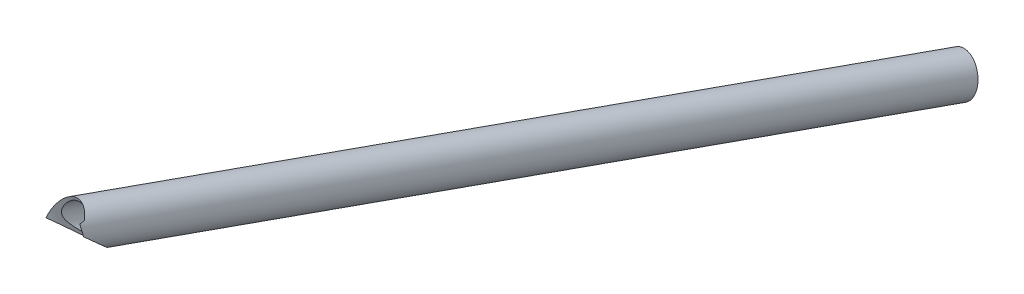
ISO-10303-21;
HEADER;
FILE_DESCRIPTION(('STEP AP214'),'2;1');
FILE_NAME('part.step','',(''),(''),'','','');
FILE_SCHEMA(('AUTOMOTIVE_DESIGN { 1 0 10303 214 1 1 1 1 }'));
ENDSEC;
DATA;
#1=APPLICATION_CONTEXT('core data for automotive mechanical design processes');
#2=APPLICATION_PROTOCOL_DEFINITION('international standard','automotive_design',2000,#1);
#3=PRODUCT_CONTEXT('',#1,'mechanical');
#4=PRODUCT('Part','Part','',(#3));
#5=PRODUCT_RELATED_PRODUCT_CATEGORY('part','',(#4));
#6=PRODUCT_DEFINITION_FORMATION('','',#4);
#7=PRODUCT_DEFINITION_CONTEXT('part definition',#1,'design');
#8=PRODUCT_DEFINITION('design','',#6,#7);
#9=PRODUCT_DEFINITION_SHAPE('','',#8);
#10=(LENGTH_UNIT() NAMED_UNIT(*) SI_UNIT(.MILLI.,.METRE.));
#11=(NAMED_UNIT(*) PLANE_ANGLE_UNIT() SI_UNIT($,.RADIAN.));
#12=(NAMED_UNIT(*) SI_UNIT($,.STERADIAN.) SOLID_ANGLE_UNIT());
#13=UNCERTAINTY_MEASURE_WITH_UNIT(LENGTH_MEASURE(1.E-05),#10,'distance_accuracy_value','');
#14=(GEOMETRIC_REPRESENTATION_CONTEXT(3) GLOBAL_UNCERTAINTY_ASSIGNED_CONTEXT((#13)) GLOBAL_UNIT_ASSIGNED_CONTEXT((#10,
#11,#12)) REPRESENTATION_CONTEXT('',''));
#15=CARTESIAN_POINT('',(0.,0.,0.));
#16=DIRECTION('',(0.,0.,1.));
#17=DIRECTION('',(1.,0.,0.));
#18=AXIS2_PLACEMENT_3D('',#15,#16,#17);
#19=CARTESIAN_POINT('',(-325.,320.000000000001,-1580.));
#20=DIRECTION('',(0.171152156864514,-0.228202875819352,-0.958452078441276));
#21=DIRECTION('',(0.,0.972806214685367,-0.23162052730604));
#22=AXIS2_PLACEMENT_3D('',#19,#20,#21);
#23=CYLINDRICAL_SURFACE('',#22,9.39999999999998);
#24=CARTESIAN_POINT('',(-250.,220.,-2000.));
#25=DIRECTION('',(-0.171152156864514,0.228202875819352,0.958452078441277));
#26=DIRECTION('',(-0.166932001795752,-0.965457944067909,0.200061653028832));
#27=AXIS2_PLACEMENT_3D('',#24,#25,#26);
#28=CIRCLE('',#27,9.39999999999998);
#29=CARTESIAN_POINT('',(-251.56916081688,210.924695325762,-1998.11942046153));
#30=VERTEX_POINT('',#29);
#31=EDGE_CURVE('E85',#30,#30,#28,.T.);
#32=ORIENTED_EDGE('',*,*,#31,.F.);
#33=EDGE_LOOP('',(#32));
#34=FACE_BOUND('',#33,.T.);
#35=CARTESIAN_POINT('',(-323.834415471578,327.59026571348,-1588.70450631584));
#36=CARTESIAN_POINT('',(-324.080552006862,327.577466463839,-1588.75825609491));
#37=CARTESIAN_POINT('',(-324.327478743588,327.555557959207,-1588.80649440767));
#38=CARTESIAN_POINT('',(-324.821156436724,327.493645809781,-1588.89141500774));
#39=CARTESIAN_POINT('',(-325.067907234112,327.453632726062,-1588.92809125015));
#40=CARTESIAN_POINT('',(-325.559825618034,327.355700246801,-1588.98961668672));
#41=CARTESIAN_POINT('',(-325.804989290469,327.297746866523,-1589.01444320484));
#42=CARTESIAN_POINT('',(-326.291463033352,327.164389122346,-1589.05207811223));
#43=CARTESIAN_POINT('',(-326.53277301981,327.088984378654,-1589.06488623991));
#44=CARTESIAN_POINT('',(-327.009379935524,326.921430057232,-1589.07861231871));
#45=CARTESIAN_POINT('',(-327.244686536722,326.829309646057,-1589.07955078221));
#46=CARTESIAN_POINT('',(-327.70806791084,326.628894797553,-1589.06995092724));
#47=CARTESIAN_POINT('',(-327.93614245529,326.520599849862,-1589.05941224657));
#48=CARTESIAN_POINT('',(-328.383345858126,326.288647126785,-1589.02744625941));
#49=CARTESIAN_POINT('',(-328.602480592927,326.164999666521,-1589.00602623435));
#50=CARTESIAN_POINT('',(-329.030524655983,325.903049163857,-1588.95309239752));
#51=CARTESIAN_POINT('',(-329.239433891182,325.764745988118,-1588.92157849391));
#52=CARTESIAN_POINT('',(-329.650007841533,325.471159894831,-1588.84869720761));
#53=CARTESIAN_POINT('',(-329.851424798961,325.315578971338,-1588.80713494581));
#54=CARTESIAN_POINT('',(-330.240892392669,324.99068825396,-1588.71585058036));
#55=CARTESIAN_POINT('',(-330.42894265978,324.821378081171,-1588.66612825148));
#56=CARTESIAN_POINT('',(-330.790788004269,324.469365236695,-1588.56002036997));
#57=CARTESIAN_POINT('',(-330.964554073481,324.286636672905,-1588.50362179942));
#58=CARTESIAN_POINT('',(-331.296184707491,323.908664127424,-1588.38620044706));
#59=CARTESIAN_POINT('',(-331.454049288119,323.713420158193,-1588.32517766986));
#60=CARTESIAN_POINT('',(-331.760466766664,323.300283606448,-1588.19763997354));
#61=CARTESIAN_POINT('',(-331.908094526568,323.08174001706,-1588.13100495215));
#62=CARTESIAN_POINT('',(-332.182766403172,322.631629198616,-1587.99876469396));
#63=CARTESIAN_POINT('',(-332.309803773906,322.400057734616,-1587.93315980099));
#64=CARTESIAN_POINT('',(-332.541004941817,321.925198488006,-1587.80770986571));
#65=CARTESIAN_POINT('',(-332.645241773913,321.681951251977,-1587.74784678772));
#66=CARTESIAN_POINT('',(-332.82917542355,321.184003126055,-1587.63933725985));
#67=CARTESIAN_POINT('',(-332.908895966664,320.929313584797,-1587.59067997711));
#68=CARTESIAN_POINT('',(-333.014610087916,320.516293099345,-1587.52749257937));
#69=CARTESIAN_POINT('',(-333.049254848018,320.361032859928,-1587.50713768447));
#70=CARTESIAN_POINT('',(-333.108854218186,320.047872813642,-1587.47417435727));
#71=CARTESIAN_POINT('',(-333.133812451922,319.889974016944,-1587.46156302712));
#72=CARTESIAN_POINT('',(-333.173785716508,319.572770723275,-1587.44543810822));
#73=CARTESIAN_POINT('',(-333.188820769446,319.41346971814,-1587.44190615796));
#74=CARTESIAN_POINT('',(-333.209046760567,319.094324796429,-1587.44492915903));
#75=CARTESIAN_POINT('',(-333.21423765519,318.934480877454,-1587.451484155));
#76=CARTESIAN_POINT('',(-333.215088752941,318.615234920238,-1587.47528006625));
#77=CARTESIAN_POINT('',(-333.210729349033,318.455834465033,-1587.49254291291));
#78=CARTESIAN_POINT('',(-333.193053295517,318.139078831091,-1587.53778482445));
#79=CARTESIAN_POINT('',(-333.179736595658,317.981723663832,-1587.56576394946));
#80=CARTESIAN_POINT('',(-333.144958740648,317.669898587308,-1587.63196349523));
#81=CARTESIAN_POINT('',(-333.123486705865,317.515432822747,-1587.67019757652));
#82=CARTESIAN_POINT('',(-333.073336974998,317.210286633319,-1587.75598729177));
#83=CARTESIAN_POINT('',(-333.044656655895,317.05960760841,-1587.80354631759));
#84=CARTESIAN_POINT('',(-332.963801618367,316.682010962304,-1587.9348515306));
#85=CARTESIAN_POINT('',(-332.907313069779,316.457977402876,-1588.02425037526));
#86=CARTESIAN_POINT('',(-332.782423859762,316.020104735161,-1588.21835816646));
#87=CARTESIAN_POINT('',(-332.71401503809,315.806272739112,-1588.32307759307));
#88=CARTESIAN_POINT('',(-332.567245415488,315.387374204256,-1588.54453208092));
#89=CARTESIAN_POINT('',(-332.488846264602,315.182345744201,-1588.66131309721));
#90=CARTESIAN_POINT('',(-332.32389504586,314.781004217455,-1588.90354278557));
#91=CARTESIAN_POINT('',(-332.237344481725,314.584689553091,-1589.02898985784));
#92=CARTESIAN_POINT('',(-332.046125637414,314.176234055163,-1589.30197479774));
#93=CARTESIAN_POINT('',(-331.940535090583,313.965083050819,-1589.45034094011));
#94=CARTESIAN_POINT('',(-331.721279275057,313.551138813694,-1589.75272208662));
#95=CARTESIAN_POINT('',(-331.607611952751,313.348347727377,-1589.90673852256));
#96=CARTESIAN_POINT('',(-331.372615532369,312.949992376748,-1590.21872894639));
#97=CARTESIAN_POINT('',(-331.251278411764,312.754436030405,-1590.3767069703));
#98=CARTESIAN_POINT('',(-331.001315627626,312.370073165263,-1590.69502678437));
#99=CARTESIAN_POINT('',(-330.872690639092,312.181266023987,-1590.8553683546));
#100=CARTESIAN_POINT('',(-330.608163256313,311.809823110132,-1591.17733579031));
#101=CARTESIAN_POINT('',(-330.472258605593,311.627189280039,-1591.33896204062));
#102=CARTESIAN_POINT('',(-330.193125457154,311.267840683443,-1591.66248567212));
#103=CARTESIAN_POINT('',(-330.049896695779,311.091126130404,-1591.82438306286));
#104=CARTESIAN_POINT('',(-329.756038566786,310.743617982318,-1592.14745564911));
#105=CARTESIAN_POINT('',(-329.605414901688,310.57281999288,-1592.30863129968));
#106=CARTESIAN_POINT('',(-329.296389453008,310.237046119542,-1592.6295510097));
#107=CARTESIAN_POINT('',(-329.13798820081,310.072069839209,-1592.78929516606));
#108=CARTESIAN_POINT('',(-328.764130082098,309.699366194971,-1593.15427298318));
#109=CARTESIAN_POINT('',(-328.545843104211,309.493706421324,-1593.35873617207));
#110=CARTESIAN_POINT('',(-328.094348868316,309.093311197553,-1593.76196943227));
#111=CARTESIAN_POINT('',(-327.861139269231,308.898577470558,-1593.96073860318));
#112=CARTESIAN_POINT('',(-327.378939521375,308.521820622981,-1594.34992063051));
#113=CARTESIAN_POINT('',(-327.129978114191,308.339775557244,-1594.54034769147));
#114=CARTESIAN_POINT('',(-326.614424171647,307.990205853498,-1594.91032338217));
#115=CARTESIAN_POINT('',(-326.347839104655,307.822675133417,-1595.08987655888));
#116=CARTESIAN_POINT('',(-325.893129929882,307.561468787551,-1595.37336333581));
#117=CARTESIAN_POINT('',(-325.710626061897,307.462637887014,-1595.48157096279));
#118=CARTESIAN_POINT('',(-325.337135763021,307.273542157927,-1595.69052432616));
#119=CARTESIAN_POINT('',(-325.146151644287,307.183275015249,-1595.79127207677));
#120=CARTESIAN_POINT('',(-324.75543131999,307.012801093401,-1595.98364259383));
#121=CARTESIAN_POINT('',(-324.555701816291,306.932586786385,-1596.07527217751));
#122=CARTESIAN_POINT('',(-324.147362457813,306.784009958758,-1596.24743249048));
#123=CARTESIAN_POINT('',(-323.938756057269,306.715642879665,-1596.32796748621));
#124=CARTESIAN_POINT('',(-323.426669947246,306.568169897182,-1596.50535517723));
#125=CARTESIAN_POINT('',(-323.1187985688,306.495817084973,-1596.59572904064));
#126=CARTESIAN_POINT('',(-322.646674335689,306.413556047339,-1596.7052555038));
#127=CARTESIAN_POINT('',(-322.487615925385,306.390515897418,-1596.73742108531));
#128=CARTESIAN_POINT('',(-322.166778325434,306.354123809699,-1596.79203190401));
#129=CARTESIAN_POINT('',(-322.005000915294,306.340765769914,-1596.81448325983));
#130=CARTESIAN_POINT('',(-321.70706597644,306.325967231763,-1596.84580092447));
#131=CARTESIAN_POINT('',(-321.571160265436,306.322904208116,-1596.85631373485));
#132=CARTESIAN_POINT('',(-321.299056897891,306.324512855289,-1596.86941895576));
#133=CARTESIAN_POINT('',(-321.162859410912,306.329180848752,-1596.87201513026));
#134=CARTESIAN_POINT('',(-320.891113947177,306.346529159757,-1596.86893493615));
#135=CARTESIAN_POINT('',(-320.755565736483,306.359206331912,-1596.86326181393));
#136=CARTESIAN_POINT('',(-320.486089209073,306.392678001435,-1596.84347261754));
#137=CARTESIAN_POINT('',(-320.352160917215,306.41347262321,-1596.82935641396));
#138=CARTESIAN_POINT('',(-320.086813130703,306.463113295791,-1596.79269746667));
#139=CARTESIAN_POINT('',(-319.955396718475,306.491968635585,-1596.77014499096));
#140=CARTESIAN_POINT('',(-319.696207740455,306.557422534698,-1596.71687273294));
#141=CARTESIAN_POINT('',(-319.568435114355,306.594020965776,-1596.6861530859));
#142=CARTESIAN_POINT('',(-319.317289051186,306.674515440237,-1596.6169742453));
#143=CARTESIAN_POINT('',(-319.19391808586,306.718415507874,-1596.57851078131));
#144=CARTESIAN_POINT('',(-318.952269699833,306.812911003643,-1596.49444214755));
#145=CARTESIAN_POINT('',(-318.83399344405,306.863507952376,-1596.44883535538));
#146=CARTESIAN_POINT('',(-318.572116451982,306.985069437859,-1596.33809840013));
#147=CARTESIAN_POINT('',(-318.43018976881,307.057864429977,-1596.27100725703));
#148=CARTESIAN_POINT('',(-318.155705557008,307.211763196728,-1596.12788509369));
#149=CARTESIAN_POINT('',(-318.023150531193,307.292869176851,-1596.05185169964));
#150=CARTESIAN_POINT('',(-317.639260870471,307.546952410769,-1595.8121828116));
#151=CARTESIAN_POINT('',(-317.401971764783,307.73056505665,-1595.63709766748));
#152=CARTESIAN_POINT('',(-317.010026699719,308.075636517461,-1595.30602239021));
#153=CARTESIAN_POINT('',(-316.8485582168,308.23341539287,-1595.15397613121));
#154=CARTESIAN_POINT('',(-316.545231788396,308.558197822579,-1594.84022638547));
#155=CARTESIAN_POINT('',(-316.403385862841,308.725206944046,-1594.67851706563));
#156=CARTESIAN_POINT('',(-316.137258997965,309.066428875305,-1594.34785261736));
#157=CARTESIAN_POINT('',(-316.013006147799,309.240652643468,-1594.17888645084));
#158=CARTESIAN_POINT('',(-315.780391168805,309.594607976197,-1593.83577412747));
#159=CARTESIAN_POINT('',(-315.672034946656,309.774341558197,-1593.66162607396));
#160=CARTESIAN_POINT('',(-315.476575967215,310.1256999562,-1593.32172823332));
#161=CARTESIAN_POINT('',(-315.388525617351,310.297036443015,-1593.15622070878));
#162=CARTESIAN_POINT('',(-315.22372515978,310.64285540028,-1592.82296839567));
#163=CARTESIAN_POINT('',(-315.14697332076,310.817337384123,-1592.65522395417));
#164=CARTESIAN_POINT('',(-315.003727658747,311.169190474119,-1592.31808205767));
#165=CARTESIAN_POINT('',(-314.937242718611,311.346563936915,-1592.14868330459));
#166=CARTESIAN_POINT('',(-314.813795994166,311.7037779682,-1591.80900426694));
#167=CARTESIAN_POINT('',(-314.756835335582,311.883618825609,-1591.63872388061));
#168=CARTESIAN_POINT('',(-314.598891723552,312.427569683459,-1591.12645953044));
#169=CARTESIAN_POINT('',(-314.511232037035,312.795140940674,-1590.78398317987));
#170=CARTESIAN_POINT('',(-314.367270081115,313.538798268257,-1590.10224527211));
#171=CARTESIAN_POINT('',(-314.310952675492,313.914880137089,-1589.76298224105));
#172=CARTESIAN_POINT('',(-314.23262200301,314.626090448516,-1589.13659251264));
#173=CARTESIAN_POINT('',(-314.207040046415,314.960005721844,-1588.84853772149));
#174=CARTESIAN_POINT('',(-314.184301710917,315.467579763005,-1588.42347944664));
#175=CARTESIAN_POINT('',(-314.17932895115,315.637943881185,-1588.28291989617));
#176=CARTESIAN_POINT('',(-314.174607728033,315.981163695548,-1588.00479441502));
#177=CARTESIAN_POINT('',(-314.174858919671,316.154019226436,-1587.86722828724));
#178=CARTESIAN_POINT('',(-314.180638972995,316.501904663656,-1587.59633837321));
#179=CARTESIAN_POINT('',(-314.186148073709,316.676924007528,-1587.46300063327));
#180=CARTESIAN_POINT('',(-314.202568148781,317.030141417863,-1587.20097323751));
#181=CARTESIAN_POINT('',(-314.213478474178,317.208339099967,-1587.07228302528));
#182=CARTESIAN_POINT('',(-314.240948121954,317.568219553483,-1586.82082198692));
#183=CARTESIAN_POINT('',(-314.257502426471,317.749899094347,-1586.69804601294));
#184=CARTESIAN_POINT('',(-314.296649112238,318.117334491547,-1586.45982006859));
#185=CARTESIAN_POINT('',(-314.319239934195,318.303089283847,-1586.34436821584));
#186=CARTESIAN_POINT('',(-314.367231195165,318.651662463937,-1586.13890612299));
#187=CARTESIAN_POINT('',(-314.391737800838,318.813863078947,-1586.04764421555));
#188=CARTESIAN_POINT('',(-314.446017383221,319.141805464787,-1585.87334582024));
#189=CARTESIAN_POINT('',(-314.475790464337,319.307547305764,-1585.79030949549));
#190=CARTESIAN_POINT('',(-314.541119336489,319.642386773494,-1585.6343545354));
#191=CARTESIAN_POINT('',(-314.576667664313,319.811479825185,-1585.56142306424));
#192=CARTESIAN_POINT('',(-314.654217470857,320.152946670487,-1585.42759753076));
#193=CARTESIAN_POINT('',(-314.696217772213,320.325319860517,-1585.36670127687));
#194=CARTESIAN_POINT('',(-314.780529272726,320.646614070628,-1585.26712294766));
#195=CARTESIAN_POINT('',(-314.821852995623,320.795183627875,-1585.22648019174));
#196=CARTESIAN_POINT('',(-314.910041537052,321.09335130892,-1585.15662987732));
#197=CARTESIAN_POINT('',(-314.956904870028,321.242949146875,-1585.12741926207));
#198=CARTESIAN_POINT('',(-315.056434428469,321.541946119457,-1585.08133920329));
#199=CARTESIAN_POINT('',(-315.10909411385,321.691345289389,-1585.06445601157));
#200=CARTESIAN_POINT('',(-315.22044334305,321.988794846315,-1585.04337429259));
#201=CARTESIAN_POINT('',(-315.279132905648,322.136845229106,-1585.03917580485));
#202=CARTESIAN_POINT('',(-315.402601448058,322.430253446884,-1585.04325775314));
#203=CARTESIAN_POINT('',(-315.467382181344,322.575610492032,-1585.05154179291));
#204=CARTESIAN_POINT('',(-315.602938464195,322.862320915967,-1585.07980773188));
#205=CARTESIAN_POINT('',(-315.673714145067,323.003674206969,-1585.09978988736));
#206=CARTESIAN_POINT('',(-315.821236461788,323.281612722151,-1585.15027792728));
#207=CARTESIAN_POINT('',(-315.897993862083,323.418188678307,-1585.18080313978));
#208=CARTESIAN_POINT('',(-316.057185668084,323.685601863997,-1585.25091323472));
#209=CARTESIAN_POINT('',(-316.1396217218,323.816437409414,-1585.29050075496));
#210=CARTESIAN_POINT('',(-316.343469915649,324.122115339912,-1585.39426542972));
#211=CARTESIAN_POINT('',(-316.467464486317,324.29403814663,-1585.46199129768));
#212=CARTESIAN_POINT('',(-316.725624112774,324.625206208774,-1585.60821013914));
#213=CARTESIAN_POINT('',(-316.859793264267,324.784446305415,-1585.68670745902));
#214=CARTESIAN_POINT('',(-317.138020757849,325.090204484307,-1585.8512119083));
#215=CARTESIAN_POINT('',(-317.282089976729,325.236708160158,-1585.93722732667));
#216=CARTESIAN_POINT('',(-317.57958886224,325.516762959369,-1586.11390280363));
#217=CARTESIAN_POINT('',(-317.733017546684,325.650315438039,-1586.20456237471));
#218=CARTESIAN_POINT('',(-318.054100845005,325.908707098169,-1586.39128217298));
#219=CARTESIAN_POINT('',(-318.222058020025,326.033112491108,-1586.48742186639));
#220=CARTESIAN_POINT('',(-318.567134646606,326.268111222953,-1586.6801282917));
#221=CARTESIAN_POINT('',(-318.744254281775,326.378704284919,-1586.77669503212));
#222=CARTESIAN_POINT('',(-319.107177433378,326.585998957504,-1586.96850833114));
#223=CARTESIAN_POINT('',(-319.292982421424,326.682698202617,-1587.06375466245));
#224=CARTESIAN_POINT('',(-319.672651997352,326.862023517708,-1587.25139562963));
#225=CARTESIAN_POINT('',(-319.866516894769,326.944649046569,-1587.34379015575));
#226=CARTESIAN_POINT('',(-320.29657214799,327.108975133783,-1587.54037937594));
#227=CARTESIAN_POINT('',(-320.534186042246,327.187929742407,-1587.64377246663));
#228=CARTESIAN_POINT('',(-321.018368498484,327.325703913402,-1587.84291030181));
#229=CARTESIAN_POINT('',(-321.26493932524,327.384518343544,-1587.93865309205));
#230=CARTESIAN_POINT('',(-321.76494004744,327.481533674739,-1588.12065254377));
#231=CARTESIAN_POINT('',(-322.018354958506,327.519776293892,-1588.2069281189));
#232=CARTESIAN_POINT('',(-322.530686405035,327.575525472343,-1588.36879240461));
#233=CARTESIAN_POINT('',(-322.789599291635,327.59304537234,-1588.44438796304));
#234=CARTESIAN_POINT('',(-323.180239635198,327.603673489865,-1588.54881946825));
#235=CARTESIAN_POINT('',(-323.310624077949,327.604618353486,-1588.58209085996));
#236=CARTESIAN_POINT('',(-323.572069223178,327.601327989631,-1588.64559965692));
#237=CARTESIAN_POINT('',(-323.703129941407,327.597092640953,-1588.67583699118));
#238=CARTESIAN_POINT('',(-323.834415471578,327.59026571348,-1588.70450631584));
#239=B_SPLINE_CURVE_WITH_KNOTS('',3,(#35,#36,#37,#38,#39,#40,#41,#42,#43,#44,#45,#46,#47,#48,
#49,#50,#51,#52,#53,#54,#55,#56,#57,#58,#59,#60,#61,#62,#63,#64,#65,#66,#67,#68,#69,#70,#71,#72,
#73,#74,#75,#76,#77,#78,#79,#80,#81,#82,#83,#84,#85,#86,#87,#88,#89,#90,#91,#92,#93,#94,#95,#96,
#97,#98,#99,#100,#101,#102,#103,#104,#105,#106,#107,#108,#109,#110,#111,#112,#113,#114,#115,
#116,#117,#118,#119,#120,#121,#122,#123,#124,#125,#126,#127,#128,#129,#130,#131,#132,#133,#134,
#135,#136,#137,#138,#139,#140,#141,#142,#143,#144,#145,#146,#147,#148,#149,#150,#151,#152,#153,
#154,#155,#156,#157,#158,#159,#160,#161,#162,#163,#164,#165,#166,#167,#168,#169,#170,#171,#172,
#173,#174,#175,#176,#177,#178,#179,#180,#181,#182,#183,#184,#185,#186,#187,#188,#189,#190,#191,
#192,#193,#194,#195,#196,#197,#198,#199,#200,#201,#202,#203,#204,#205,#206,#207,#208,#209,#210,
#211,#212,#213,#214,#215,#216,#217,#218,#219,#220,#221,#222,#223,#224,#225,#226,#227,#228,#229,
#230,#231,#232,#233,#234,#235,#236,#237,#238),.UNSPECIFIED.,.T.,.F.,(4,2,2,2,2,2,2,2,2,2,2,2,2,
2,2,2,2,2,2,2,2,2,2,2,2,2,2,2,2,2,2,2,2,2,2,2,2,2,2,2,2,2,2,2,2,2,2,2,2,2,2,2,2,2,2,2,2,2,2,2,2,
2,2,2,2,2,2,2,2,2,2,2,2,2,2,2,2,2,2,2,2,2,2,2,2,2,2,2,2,2,2,2,2,2,2,2,2,2,2,2,2,4),(0.,
0.756658880141853,1.51371270405642,2.27220950102652,3.03072280673517,3.7879251193972,
4.54515132945607,5.3018714961198,6.05859854806702,6.83138145050952,7.60418568774039,
8.37852242953097,9.15285840051264,9.96788171053111,10.7831715066716,11.5958102191478,
12.4076600097741,12.8883597913961,13.3688795723496,13.8484268159822,14.3279761816257,
14.8085109982884,15.2890485107207,15.7702293492152,16.25158553852,16.9935120332988,
17.7359484373884,18.481325905688,19.2265661398175,20.0626948748915,20.8990369712288,
21.7362688320746,22.5734232751933,23.4108387296355,24.2482843510248,25.085094027116,
25.9218466095262,27.0102937284362,28.0989120247197,29.1855982624875,30.2718269117786,
30.9736484012981,31.675279698752,32.3763824152336,33.0772147651236,34.0601253935457,
34.5513661947502,35.042297129788,35.4509236580149,35.8593558736567,36.2676277882621,
36.6759059602161,37.084656577463,37.4934004255784,37.9023703015196,38.31143319835,
38.8297579696564,39.3482206469941,40.3861014409637,41.2016527261994,42.0177013915291,
42.8350386151506,43.6526787701918,44.4142895508482,45.1757835053162,45.93793265221,
46.7001718179343,48.2288287981736,49.7567468976055,51.0812590576334,51.7439418782124,
52.4065809326819,53.0667393357995,53.7268184396469,54.3863122142279,55.0456357992917,
55.6085521903189,56.1714797422773,56.7336855399884,57.2957888672505,57.7737582252493,
58.2515996957781,58.7289074349061,59.2062166606232,59.6836637132042,60.1611212260396,
60.639458724581,61.1179356317019,61.7845096387313,62.4513534094403,63.1189419032932,
63.7864604601316,64.4760380066595,65.1656293771657,65.8553380158991,66.5450731670222,
67.3567463148581,68.1686261440203,68.9788532744427,69.7885585191791,70.1921395556203,
70.5957300348754),.UNSPECIFIED.);
#240=CARTESIAN_POINT('',(-323.834415471578,327.59026571348,-1588.70450631584));
#241=VERTEX_POINT('',#240);
#242=EDGE_CURVE('E92',#241,#241,#239,.T.);
#243=ORIENTED_EDGE('',*,*,#242,.T.);
#244=EDGE_LOOP('',(#243));
#245=FACE_BOUND('',#244,.T.);
#246=ADVANCED_FACE('F41',(#34,#245),#23,.F.);
#247=CARTESIAN_POINT('',(-325.,320.000000000001,-1580.));
#248=DIRECTION('',(0.171152156864514,-0.228202875819352,-0.958452078441276));
#249=DIRECTION('',(0.,0.972806214685367,-0.23162052730604));
#250=AXIS2_PLACEMENT_3D('',#247,#248,#249);
#251=CYLINDRICAL_SURFACE('',#250,11.);
#252=CARTESIAN_POINT('',(-250.,220.,-2000.));
#253=DIRECTION('',(-0.171152156864514,0.228202875819352,0.958452078441277));
#254=DIRECTION('',(-0.166932001795752,-0.965457944067909,0.200061653028832));
#255=AXIS2_PLACEMENT_3D('',#252,#253,#254);
#256=CIRCLE('',#255,11.);
#257=CARTESIAN_POINT('',(-251.836252019753,209.379962615253,-1997.79932181668));
#258=VERTEX_POINT('',#257);
#259=EDGE_CURVE('E87',#258,#258,#256,.T.);
#260=ORIENTED_EDGE('',*,*,#259,.T.);
#261=EDGE_LOOP('',(#260));
#262=FACE_BOUND('',#261,.T.);
#263=CARTESIAN_POINT('',(-325.,320.,-1580.));
#264=DIRECTION('',(0.526991553913357,-0.846050959333568,-0.0804840127897105));
#265=DIRECTION('',(-0.020132316108703,0.0822472927426935,-0.996408587219418));
#266=AXIS2_PLACEMENT_3D('',#263,#264,#265);
#267=ELLIPSE('',#266,30.5210436776293,11.);
#268=CARTESIAN_POINT('',(-315.659557692804,325.81486052971,-1579.96687694731));
#269=VERTEX_POINT('',#268);
#270=CARTESIAN_POINT('',(-315.751220700313,326.001625780896,-1582.53034941331));
#271=VERTEX_POINT('',#270);
#272=EDGE_CURVE('E70',#269,#271,#267,.F.);
#273=ORIENTED_EDGE('',*,*,#272,.F.);
#274=CARTESIAN_POINT('',(-325.,320.000000000001,-1580.));
#275=DIRECTION('',(-0.0427126536783039,0.0629297921225689,0.997103540500768));
#276=DIRECTION('',(0.611440895819701,-0.787641342485716,0.0759022168747455));
#277=AXIS2_PLACEMENT_3D('',#274,#275,#276);
#278=ELLIPSE('',#277,11.2549576190536,11.);
#279=CARTESIAN_POINT('',(-314.891903689015,324.374891386588,-1579.84311297151));
#280=VERTEX_POINT('',#279);
#281=EDGE_CURVE('E46',#280,#269,#278,.T.);
#282=ORIENTED_EDGE('',*,*,#281,.F.);
#283=CARTESIAN_POINT('',(-325.,320.,-1580.));
#284=DIRECTION('',(-0.020132316108703,0.0822472927426935,-0.996408587219418));
#285=DIRECTION('',(0.526991553913357,-0.846050959333568,-0.0804840127897105));
#286=AXIS2_PLACEMENT_3D('',#283,#284,#285);
#287=ELLIPSE('',#286,11.7925144812184,11.);
#288=CARTESIAN_POINT('',(-313.841284703454,320.540121803661,-1580.18087683098));
#289=VERTEX_POINT('',#288);
#290=EDGE_CURVE('E73',#289,#280,#287,.F.);
#291=ORIENTED_EDGE('',*,*,#290,.F.);
#292=CARTESIAN_POINT('',(-325.,320.000000000001,-1580.));
#293=DIRECTION('',(-0.046806891515563,0.743683273485426,-0.666891523146495));
#294=DIRECTION('',(0.217268286027578,-0.644059979147453,-0.733472041148959));
#295=AXIS2_PLACEMENT_3D('',#292,#293,#294);
#296=ELLIPSE('',#295,23.8372924851441,11.);
#297=CARTESIAN_POINT('',(-335.724879319694,318.028514830939,-1581.44575579064));
#298=VERTEX_POINT('',#297);
#299=EDGE_CURVE('E51',#298,#289,#296,.F.);
#300=ORIENTED_EDGE('',*,*,#299,.F.);
#301=CARTESIAN_POINT('',(-325.,320.000000000001,-1580.));
#302=DIRECTION('',(0.217268286027578,-0.644059979147453,-0.733472041148959));
#303=DIRECTION('',(-0.046806891515563,0.743683273485426,-0.666891523146495));
#304=AXIS2_PLACEMENT_3D('',#301,#302,#303);
#305=ELLIPSE('',#304,12.3991151975754,11.);
#306=EDGE_CURVE('E61',#271,#298,#305,.F.);
#307=ORIENTED_EDGE('',*,*,#306,.F.);
#308=EDGE_LOOP('',(#273,#282,#291,#300,#307));
#309=FACE_BOUND('',#308,.T.);
#310=ADVANCED_FACE('F84',(#262,#309),#251,.T.);
#311=CARTESIAN_POINT('',(-250.,220.,-2000.));
#312=DIRECTION('',(-0.171152156864514,0.228202875819352,0.958452078441277));
#313=DIRECTION('',(-0.166932001795752,-0.965457944067909,0.200061653028832));
#314=AXIS2_PLACEMENT_3D('',#311,#312,#313);
#315=PLANE('',#314);
#316=ORIENTED_EDGE('',*,*,#31,.T.);
#317=EDGE_LOOP('',(#316));
#318=FACE_BOUND('',#317,.T.);
#319=ORIENTED_EDGE('',*,*,#259,.F.);
#320=EDGE_LOOP('',(#319));
#321=FACE_BOUND('',#320,.T.);
#322=ADVANCED_FACE('F106',(#318,#321),#315,.F.);
#323=CARTESIAN_POINT('',(-325.,320.,-1580.));
#324=DIRECTION('',(-0.0427126536783039,0.0629297921225689,0.997103540500768));
#325=DIRECTION('',(0.,-0.998014330188054,0.0629872744234134));
#326=AXIS2_PLACEMENT_3D('',#323,#324,#325);
#327=PLANE('',#326);
#328=ORIENTED_EDGE('',*,*,#281,.T.);
#329=CARTESIAN_POINT('',(-325.,320.,-1580.));
#330=DIRECTION('',(-0.0427126536783039,0.0629297921225689,0.997103540500768));
#331=DIRECTION('',(0.489400664257567,-0.868759037548238,0.0757939608577898));
#332=AXIS2_PLACEMENT_3D('',#329,#330,#331);
#333=ELLIPSE('',#332,12.7182524712078,11.);
#334=EDGE_CURVE('E76',#269,#280,#333,.F.);
#335=ORIENTED_EDGE('',*,*,#334,.T.);
#336=EDGE_LOOP('',(#328,#335));
#337=FACE_BOUND('',#336,.T.);
#338=ADVANCED_FACE('F82',(#337),#327,.T.);
#339=CARTESIAN_POINT('',(-325.,320.,-1580.));
#340=DIRECTION('',(0.208710809439999,-0.381642622975999,0.900438063583998));
#341=DIRECTION('',(0.,-0.920714591276893,-0.390236647958419));
#342=AXIS2_PLACEMENT_3D('',#339,#340,#341);
#343=CYLINDRICAL_SURFACE('',#342,11.);
#344=ORIENTED_EDGE('',*,*,#272,.T.);
#345=CARTESIAN_POINT('',(-325.,320.,-1580.));
#346=DIRECTION('',(-0.00416950723616265,0.393939167319852,0.919127057408686));
#347=DIRECTION('',(-0.2871987901008,0.87994037819309,-0.37844654284329));
#348=AXIS2_PLACEMENT_3D('',#345,#346,#347);
#349=ELLIPSE('',#348,16.2624994633842,11.);
#350=EDGE_CURVE('E11',#289,#271,#349,.T.);
#351=ORIENTED_EDGE('',*,*,#350,.F.);
#352=ORIENTED_EDGE('',*,*,#290,.T.);
#353=ORIENTED_EDGE('',*,*,#334,.F.);
#354=EDGE_LOOP('',(#344,#351,#352,#353));
#355=FACE_BOUND('',#354,.T.);
#356=ADVANCED_FACE('F75',(#355),#343,.F.);
#357=CARTESIAN_POINT('',(-250.,0.,-1700.));
#358=DIRECTION('',(-0.214351342090107,0.914565726251124,0.342962147344171));
#359=DIRECTION('',(0.,-0.351123441588391,0.936329177569045));
#360=AXIS2_PLACEMENT_3D('',#357,#358,#359);
#361=CYLINDRICAL_SURFACE('',#360,11.);
#362=ORIENTED_EDGE('',*,*,#242,.F.);
#363=EDGE_LOOP('',(#362));
#364=FACE_BOUND('',#363,.T.);
#365=ORIENTED_EDGE('',*,*,#306,.T.);
#366=ORIENTED_EDGE('',*,*,#299,.T.);
#367=ORIENTED_EDGE('',*,*,#350,.T.);
#368=EDGE_LOOP('',(#365,#366,#367));
#369=FACE_BOUND('',#368,.T.);
#370=ADVANCED_FACE('F43',(#364,#369),#361,.F.);
#371=CLOSED_SHELL('',(#246,#310,#322,#338,#356,#370));
#372=MANIFOLD_SOLID_BREP('B2',#371);
#373=ADVANCED_BREP_SHAPE_REPRESENTATION('',(#18,#372),#14);
#374=SHAPE_DEFINITION_REPRESENTATION(#9,#373);
ENDSEC;
END-ISO-10303-21;
